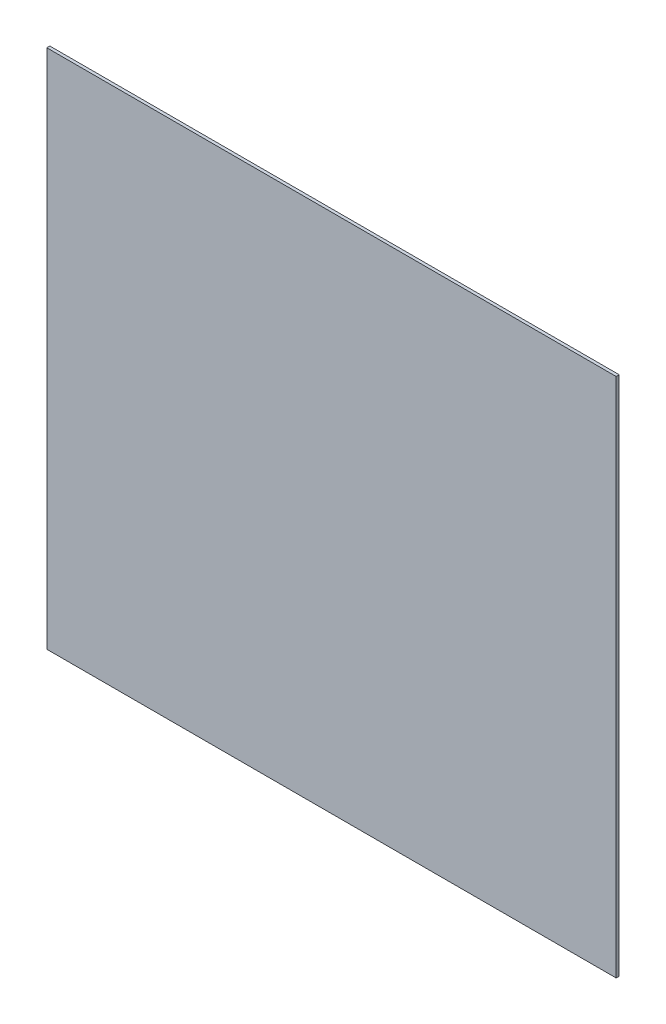
ISO-10303-21;
HEADER;
FILE_DESCRIPTION(('STEP AP214'),'2;1');
FILE_NAME('part.step','',(''),(''),'','','');
FILE_SCHEMA(('AUTOMOTIVE_DESIGN { 1 0 10303 214 1 1 1 1 }'));
ENDSEC;
DATA;
#1=APPLICATION_CONTEXT('core data for automotive mechanical design processes');
#2=APPLICATION_PROTOCOL_DEFINITION('international standard','automotive_design',2000,#1);
#3=PRODUCT_CONTEXT('',#1,'mechanical');
#4=PRODUCT('Part','Part','',(#3));
#5=PRODUCT_RELATED_PRODUCT_CATEGORY('part','',(#4));
#6=PRODUCT_DEFINITION_FORMATION('','',#4);
#7=PRODUCT_DEFINITION_CONTEXT('part definition',#1,'design');
#8=PRODUCT_DEFINITION('design','',#6,#7);
#9=PRODUCT_DEFINITION_SHAPE('','',#8);
#10=(LENGTH_UNIT() NAMED_UNIT(*) SI_UNIT(.MILLI.,.METRE.));
#11=(NAMED_UNIT(*) PLANE_ANGLE_UNIT() SI_UNIT($,.RADIAN.));
#12=(NAMED_UNIT(*) SI_UNIT($,.STERADIAN.) SOLID_ANGLE_UNIT());
#13=UNCERTAINTY_MEASURE_WITH_UNIT(LENGTH_MEASURE(1.E-05),#10,'distance_accuracy_value','');
#14=(GEOMETRIC_REPRESENTATION_CONTEXT(3) GLOBAL_UNCERTAINTY_ASSIGNED_CONTEXT((#13)) GLOBAL_UNIT_ASSIGNED_CONTEXT((#10,
#11,#12)) REPRESENTATION_CONTEXT('',''));
#15=CARTESIAN_POINT('',(0.,0.,0.));
#16=DIRECTION('',(0.,0.,1.));
#17=DIRECTION('',(1.,0.,0.));
#18=AXIS2_PLACEMENT_3D('',#15,#16,#17);
#19=CARTESIAN_POINT('',(-298.45,0.,3.175));
#20=DIRECTION('',(1.,0.,0.));
#21=DIRECTION('',(0.,0.,-1.));
#22=AXIS2_PLACEMENT_3D('',#19,#20,#21);
#23=PLANE('',#22);
#24=DIRECTION('',(0.,-1.,0.));
#25=VECTOR('',#24,1.);
#26=CARTESIAN_POINT('',(-298.45,0.,0.));
#27=LINE('',#26,#25);
#28=CARTESIAN_POINT('',(-298.45,546.1,0.));
#29=VERTEX_POINT('',#28);
#30=CARTESIAN_POINT('',(-298.45,0.,0.));
#31=VERTEX_POINT('',#30);
#32=EDGE_CURVE('E102',#29,#31,#27,.T.);
#33=ORIENTED_EDGE('',*,*,#32,.T.);
#34=DIRECTION('',(0.,0.,-1.));
#35=VECTOR('',#34,1.);
#36=CARTESIAN_POINT('',(-298.45,0.,3.175));
#37=LINE('',#36,#35);
#38=CARTESIAN_POINT('',(-298.45,0.,3.175));
#39=VERTEX_POINT('',#38);
#40=EDGE_CURVE('E11',#39,#31,#37,.T.);
#41=ORIENTED_EDGE('',*,*,#40,.F.);
#42=DIRECTION('',(0.,-1.,0.));
#43=VECTOR('',#42,1.);
#44=CARTESIAN_POINT('',(-298.45,0.,3.175));
#45=LINE('',#44,#43);
#46=CARTESIAN_POINT('',(-298.45,546.1,3.175));
#47=VERTEX_POINT('',#46);
#48=EDGE_CURVE('E90',#47,#39,#45,.T.);
#49=ORIENTED_EDGE('',*,*,#48,.F.);
#50=DIRECTION('',(0.,0.,-1.));
#51=VECTOR('',#50,1.);
#52=CARTESIAN_POINT('',(-298.45,546.1,3.175));
#53=LINE('',#52,#51);
#54=EDGE_CURVE('E98',#47,#29,#53,.T.);
#55=ORIENTED_EDGE('',*,*,#54,.T.);
#56=EDGE_LOOP('',(#33,#41,#49,#55));
#57=FACE_BOUND('',#56,.T.);
#58=ADVANCED_FACE('F39',(#57),#23,.F.);
#59=CARTESIAN_POINT('',(-298.45,0.,3.175));
#60=DIRECTION('',(0.,1.,0.));
#61=DIRECTION('',(0.,0.,1.));
#62=AXIS2_PLACEMENT_3D('',#59,#60,#61);
#63=PLANE('',#62);
#64=DIRECTION('',(1.,0.,0.));
#65=VECTOR('',#64,1.);
#66=CARTESIAN_POINT('',(-298.45,0.,0.));
#67=LINE('',#66,#65);
#68=CARTESIAN_POINT('',(298.45,0.,0.));
#69=VERTEX_POINT('',#68);
#70=EDGE_CURVE('E94',#31,#69,#67,.T.);
#71=ORIENTED_EDGE('',*,*,#70,.T.);
#72=DIRECTION('',(0.,0.,-1.));
#73=VECTOR('',#72,1.);
#74=CARTESIAN_POINT('',(298.45,0.,3.175));
#75=LINE('',#74,#73);
#76=CARTESIAN_POINT('',(298.45,0.,3.175));
#77=VERTEX_POINT('',#76);
#78=EDGE_CURVE('E47',#77,#69,#75,.T.);
#79=ORIENTED_EDGE('',*,*,#78,.F.);
#80=DIRECTION('',(1.,0.,0.));
#81=VECTOR('',#80,1.);
#82=CARTESIAN_POINT('',(-298.45,0.,3.175));
#83=LINE('',#82,#81);
#84=EDGE_CURVE('E85',#39,#77,#83,.T.);
#85=ORIENTED_EDGE('',*,*,#84,.F.);
#86=ORIENTED_EDGE('',*,*,#40,.T.);
#87=EDGE_LOOP('',(#71,#79,#85,#86));
#88=FACE_BOUND('',#87,.T.);
#89=ADVANCED_FACE('F93',(#88),#63,.F.);
#90=CARTESIAN_POINT('',(298.45,0.,3.175));
#91=DIRECTION('',(-1.,0.,0.));
#92=DIRECTION('',(0.,0.,1.));
#93=AXIS2_PLACEMENT_3D('',#90,#91,#92);
#94=PLANE('',#93);
#95=DIRECTION('',(0.,1.,0.));
#96=VECTOR('',#95,1.);
#97=CARTESIAN_POINT('',(298.45,0.,0.));
#98=LINE('',#97,#96);
#99=CARTESIAN_POINT('',(298.45,546.1,0.));
#100=VERTEX_POINT('',#99);
#101=EDGE_CURVE('E72',#69,#100,#98,.T.);
#102=ORIENTED_EDGE('',*,*,#101,.T.);
#103=DIRECTION('',(0.,0.,-1.));
#104=VECTOR('',#103,1.);
#105=CARTESIAN_POINT('',(298.45,546.1,3.175));
#106=LINE('',#105,#104);
#107=CARTESIAN_POINT('',(298.45,546.1,3.175));
#108=VERTEX_POINT('',#107);
#109=EDGE_CURVE('E95',#108,#100,#106,.T.);
#110=ORIENTED_EDGE('',*,*,#109,.F.);
#111=DIRECTION('',(0.,1.,0.));
#112=VECTOR('',#111,1.);
#113=CARTESIAN_POINT('',(298.45,0.,3.175));
#114=LINE('',#113,#112);
#115=EDGE_CURVE('E88',#77,#108,#114,.T.);
#116=ORIENTED_EDGE('',*,*,#115,.F.);
#117=ORIENTED_EDGE('',*,*,#78,.T.);
#118=EDGE_LOOP('',(#102,#110,#116,#117));
#119=FACE_BOUND('',#118,.T.);
#120=ADVANCED_FACE('F96',(#119),#94,.F.);
#121=CARTESIAN_POINT('',(-298.45,546.1,3.175));
#122=DIRECTION('',(0.,-1.,0.));
#123=DIRECTION('',(0.,0.,-1.));
#124=AXIS2_PLACEMENT_3D('',#121,#122,#123);
#125=PLANE('',#124);
#126=DIRECTION('',(-1.,0.,0.));
#127=VECTOR('',#126,1.);
#128=CARTESIAN_POINT('',(-298.45,546.1,0.));
#129=LINE('',#128,#127);
#130=EDGE_CURVE('E78',#100,#29,#129,.T.);
#131=ORIENTED_EDGE('',*,*,#130,.T.);
#132=ORIENTED_EDGE('',*,*,#54,.F.);
#133=DIRECTION('',(-1.,0.,0.));
#134=VECTOR('',#133,1.);
#135=CARTESIAN_POINT('',(-298.45,546.1,3.175));
#136=LINE('',#135,#134);
#137=EDGE_CURVE('E55',#108,#47,#136,.T.);
#138=ORIENTED_EDGE('',*,*,#137,.F.);
#139=ORIENTED_EDGE('',*,*,#109,.T.);
#140=EDGE_LOOP('',(#131,#132,#138,#139));
#141=FACE_BOUND('',#140,.T.);
#142=ADVANCED_FACE('F109',(#141),#125,.F.);
#143=CARTESIAN_POINT('',(0.,0.,3.175));
#144=DIRECTION('',(0.,0.,-1.));
#145=DIRECTION('',(-1.,0.,0.));
#146=AXIS2_PLACEMENT_3D('',#143,#144,#145);
#147=PLANE('',#146);
#148=ORIENTED_EDGE('',*,*,#48,.T.);
#149=ORIENTED_EDGE('',*,*,#84,.T.);
#150=ORIENTED_EDGE('',*,*,#115,.T.);
#151=ORIENTED_EDGE('',*,*,#137,.T.);
#152=EDGE_LOOP('',(#148,#149,#150,#151));
#153=FACE_BOUND('',#152,.T.);
#154=ADVANCED_FACE('F86',(#153),#147,.F.);
#155=CARTESIAN_POINT('',(0.,0.,0.));
#156=DIRECTION('',(0.,0.,-1.));
#157=DIRECTION('',(-1.,0.,0.));
#158=AXIS2_PLACEMENT_3D('',#155,#156,#157);
#159=PLANE('',#158);
#160=ORIENTED_EDGE('',*,*,#32,.F.);
#161=ORIENTED_EDGE('',*,*,#130,.F.);
#162=ORIENTED_EDGE('',*,*,#101,.F.);
#163=ORIENTED_EDGE('',*,*,#70,.F.);
#164=EDGE_LOOP('',(#160,#161,#162,#163));
#165=FACE_BOUND('',#164,.T.);
#166=ADVANCED_FACE('F112',(#165),#159,.T.);
#167=CLOSED_SHELL('',(#58,#89,#120,#142,#154,#166));
#168=MANIFOLD_SOLID_BREP('B2',#167);
#169=ADVANCED_BREP_SHAPE_REPRESENTATION('',(#18,#168),#14);
#170=SHAPE_DEFINITION_REPRESENTATION(#9,#169);
ENDSEC;
END-ISO-10303-21;
